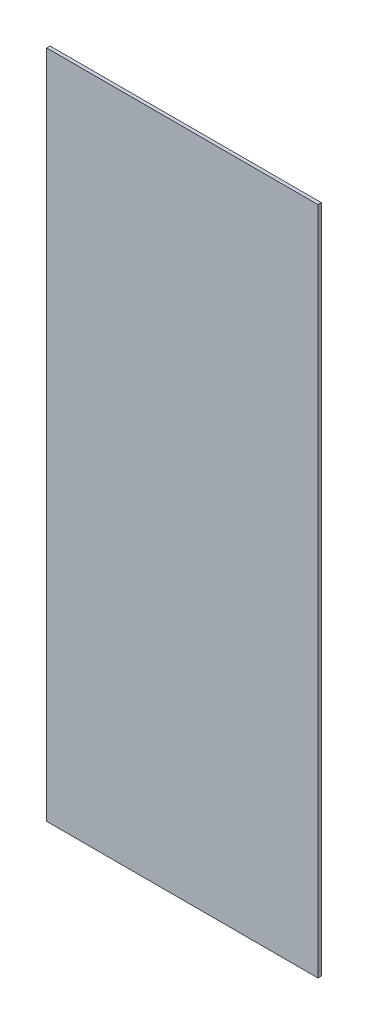
ISO-10303-21;
HEADER;
FILE_DESCRIPTION(('STEP AP214'),'2;1');
FILE_NAME('part.step','',(''),(''),'','','');
FILE_SCHEMA(('AUTOMOTIVE_DESIGN { 1 0 10303 214 1 1 1 1 }'));
ENDSEC;
DATA;
#1=APPLICATION_CONTEXT('core data for automotive mechanical design processes');
#2=APPLICATION_PROTOCOL_DEFINITION('international standard','automotive_design',2000,#1);
#3=PRODUCT_CONTEXT('',#1,'mechanical');
#4=PRODUCT('Part','Part','',(#3));
#5=PRODUCT_RELATED_PRODUCT_CATEGORY('part','',(#4));
#6=PRODUCT_DEFINITION_FORMATION('','',#4);
#7=PRODUCT_DEFINITION_CONTEXT('part definition',#1,'design');
#8=PRODUCT_DEFINITION('design','',#6,#7);
#9=PRODUCT_DEFINITION_SHAPE('','',#8);
#10=(LENGTH_UNIT() NAMED_UNIT(*) SI_UNIT(.MILLI.,.METRE.));
#11=(NAMED_UNIT(*) PLANE_ANGLE_UNIT() SI_UNIT($,.RADIAN.));
#12=(NAMED_UNIT(*) SI_UNIT($,.STERADIAN.) SOLID_ANGLE_UNIT());
#13=UNCERTAINTY_MEASURE_WITH_UNIT(LENGTH_MEASURE(1.E-05),#10,'distance_accuracy_value','');
#14=(GEOMETRIC_REPRESENTATION_CONTEXT(3) GLOBAL_UNCERTAINTY_ASSIGNED_CONTEXT((#13)) GLOBAL_UNIT_ASSIGNED_CONTEXT((#10,
#11,#12)) REPRESENTATION_CONTEXT('',''));
#15=CARTESIAN_POINT('',(0.,0.,0.));
#16=DIRECTION('',(0.,0.,1.));
#17=DIRECTION('',(1.,0.,0.));
#18=AXIS2_PLACEMENT_3D('',#15,#16,#17);
#19=CARTESIAN_POINT('',(81.,-200.,2.));
#20=DIRECTION('',(-1.,0.,0.));
#21=DIRECTION('',(0.,0.,1.));
#22=AXIS2_PLACEMENT_3D('',#19,#20,#21);
#23=PLANE('',#22);
#24=DIRECTION('',(0.,1.,0.));
#25=VECTOR('',#24,1.);
#26=CARTESIAN_POINT('',(81.,-200.,0.));
#27=LINE('',#26,#25);
#28=CARTESIAN_POINT('',(81.,-200.,0.));
#29=VERTEX_POINT('',#28);
#30=CARTESIAN_POINT('',(81.,200.,0.));
#31=VERTEX_POINT('',#30);
#32=EDGE_CURVE('E95',#29,#31,#27,.T.);
#33=ORIENTED_EDGE('',*,*,#32,.T.);
#34=DIRECTION('',(0.,0.,-1.));
#35=VECTOR('',#34,1.);
#36=CARTESIAN_POINT('',(81.,200.,2.));
#37=LINE('',#36,#35);
#38=CARTESIAN_POINT('',(81.,200.,2.));
#39=VERTEX_POINT('',#38);
#40=EDGE_CURVE('E11',#39,#31,#37,.T.);
#41=ORIENTED_EDGE('',*,*,#40,.F.);
#42=DIRECTION('',(0.,1.,0.));
#43=VECTOR('',#42,1.);
#44=CARTESIAN_POINT('',(81.,-200.,2.));
#45=LINE('',#44,#43);
#46=CARTESIAN_POINT('',(81.,-200.,2.));
#47=VERTEX_POINT('',#46);
#48=EDGE_CURVE('E83',#47,#39,#45,.T.);
#49=ORIENTED_EDGE('',*,*,#48,.F.);
#50=DIRECTION('',(0.,0.,-1.));
#51=VECTOR('',#50,1.);
#52=CARTESIAN_POINT('',(81.,-200.,2.));
#53=LINE('',#52,#51);
#54=EDGE_CURVE('E91',#47,#29,#53,.T.);
#55=ORIENTED_EDGE('',*,*,#54,.T.);
#56=EDGE_LOOP('',(#33,#41,#49,#55));
#57=FACE_BOUND('',#56,.T.);
#58=ADVANCED_FACE('F32',(#57),#23,.F.);
#59=CARTESIAN_POINT('',(-81.,200.,2.));
#60=DIRECTION('',(0.,-1.,0.));
#61=DIRECTION('',(0.,0.,-1.));
#62=AXIS2_PLACEMENT_3D('',#59,#60,#61);
#63=PLANE('',#62);
#64=DIRECTION('',(-1.,0.,0.));
#65=VECTOR('',#64,1.);
#66=CARTESIAN_POINT('',(-81.,200.,0.));
#67=LINE('',#66,#65);
#68=CARTESIAN_POINT('',(-81.,200.,0.));
#69=VERTEX_POINT('',#68);
#70=EDGE_CURVE('E87',#31,#69,#67,.T.);
#71=ORIENTED_EDGE('',*,*,#70,.T.);
#72=DIRECTION('',(0.,0.,-1.));
#73=VECTOR('',#72,1.);
#74=CARTESIAN_POINT('',(-81.,200.,2.));
#75=LINE('',#74,#73);
#76=CARTESIAN_POINT('',(-81.,200.,2.));
#77=VERTEX_POINT('',#76);
#78=EDGE_CURVE('E40',#77,#69,#75,.T.);
#79=ORIENTED_EDGE('',*,*,#78,.F.);
#80=DIRECTION('',(-1.,0.,0.));
#81=VECTOR('',#80,1.);
#82=CARTESIAN_POINT('',(-81.,200.,2.));
#83=LINE('',#82,#81);
#84=EDGE_CURVE('E78',#39,#77,#83,.T.);
#85=ORIENTED_EDGE('',*,*,#84,.F.);
#86=ORIENTED_EDGE('',*,*,#40,.T.);
#87=EDGE_LOOP('',(#71,#79,#85,#86));
#88=FACE_BOUND('',#87,.T.);
#89=ADVANCED_FACE('F86',(#88),#63,.F.);
#90=CARTESIAN_POINT('',(-81.,-200.,2.));
#91=DIRECTION('',(1.,0.,0.));
#92=DIRECTION('',(0.,0.,-1.));
#93=AXIS2_PLACEMENT_3D('',#90,#91,#92);
#94=PLANE('',#93);
#95=DIRECTION('',(0.,-1.,0.));
#96=VECTOR('',#95,1.);
#97=CARTESIAN_POINT('',(-81.,-200.,0.));
#98=LINE('',#97,#96);
#99=CARTESIAN_POINT('',(-81.,-200.,0.));
#100=VERTEX_POINT('',#99);
#101=EDGE_CURVE('E65',#69,#100,#98,.T.);
#102=ORIENTED_EDGE('',*,*,#101,.T.);
#103=DIRECTION('',(0.,0.,-1.));
#104=VECTOR('',#103,1.);
#105=CARTESIAN_POINT('',(-81.,-200.,2.));
#106=LINE('',#105,#104);
#107=CARTESIAN_POINT('',(-81.,-200.,2.));
#108=VERTEX_POINT('',#107);
#109=EDGE_CURVE('E88',#108,#100,#106,.T.);
#110=ORIENTED_EDGE('',*,*,#109,.F.);
#111=DIRECTION('',(0.,-1.,0.));
#112=VECTOR('',#111,1.);
#113=CARTESIAN_POINT('',(-81.,-200.,2.));
#114=LINE('',#113,#112);
#115=EDGE_CURVE('E81',#77,#108,#114,.T.);
#116=ORIENTED_EDGE('',*,*,#115,.F.);
#117=ORIENTED_EDGE('',*,*,#78,.T.);
#118=EDGE_LOOP('',(#102,#110,#116,#117));
#119=FACE_BOUND('',#118,.T.);
#120=ADVANCED_FACE('F89',(#119),#94,.F.);
#121=CARTESIAN_POINT('',(-81.,-200.,2.));
#122=DIRECTION('',(0.,1.,0.));
#123=DIRECTION('',(0.,0.,1.));
#124=AXIS2_PLACEMENT_3D('',#121,#122,#123);
#125=PLANE('',#124);
#126=DIRECTION('',(1.,0.,0.));
#127=VECTOR('',#126,1.);
#128=CARTESIAN_POINT('',(-81.,-200.,0.));
#129=LINE('',#128,#127);
#130=EDGE_CURVE('E71',#100,#29,#129,.T.);
#131=ORIENTED_EDGE('',*,*,#130,.T.);
#132=ORIENTED_EDGE('',*,*,#54,.F.);
#133=DIRECTION('',(1.,0.,0.));
#134=VECTOR('',#133,1.);
#135=CARTESIAN_POINT('',(-81.,-200.,2.));
#136=LINE('',#135,#134);
#137=EDGE_CURVE('E48',#108,#47,#136,.T.);
#138=ORIENTED_EDGE('',*,*,#137,.F.);
#139=ORIENTED_EDGE('',*,*,#109,.T.);
#140=EDGE_LOOP('',(#131,#132,#138,#139));
#141=FACE_BOUND('',#140,.T.);
#142=ADVANCED_FACE('F102',(#141),#125,.F.);
#143=CARTESIAN_POINT('',(0.,0.,2.));
#144=DIRECTION('',(0.,0.,-1.));
#145=DIRECTION('',(-1.,0.,0.));
#146=AXIS2_PLACEMENT_3D('',#143,#144,#145);
#147=PLANE('',#146);
#148=ORIENTED_EDGE('',*,*,#48,.T.);
#149=ORIENTED_EDGE('',*,*,#84,.T.);
#150=ORIENTED_EDGE('',*,*,#115,.T.);
#151=ORIENTED_EDGE('',*,*,#137,.T.);
#152=EDGE_LOOP('',(#148,#149,#150,#151));
#153=FACE_BOUND('',#152,.T.);
#154=ADVANCED_FACE('F79',(#153),#147,.F.);
#155=CARTESIAN_POINT('',(0.,0.,0.));
#156=DIRECTION('',(0.,0.,-1.));
#157=DIRECTION('',(-1.,0.,0.));
#158=AXIS2_PLACEMENT_3D('',#155,#156,#157);
#159=PLANE('',#158);
#160=ORIENTED_EDGE('',*,*,#32,.F.);
#161=ORIENTED_EDGE('',*,*,#130,.F.);
#162=ORIENTED_EDGE('',*,*,#101,.F.);
#163=ORIENTED_EDGE('',*,*,#70,.F.);
#164=EDGE_LOOP('',(#160,#161,#162,#163));
#165=FACE_BOUND('',#164,.T.);
#166=ADVANCED_FACE('F105',(#165),#159,.T.);
#167=CLOSED_SHELL('',(#58,#89,#120,#142,#154,#166));
#168=MANIFOLD_SOLID_BREP('B2',#167);
#169=ADVANCED_BREP_SHAPE_REPRESENTATION('',(#18,#168),#14);
#170=SHAPE_DEFINITION_REPRESENTATION(#9,#169);
ENDSEC;
END-ISO-10303-21;
